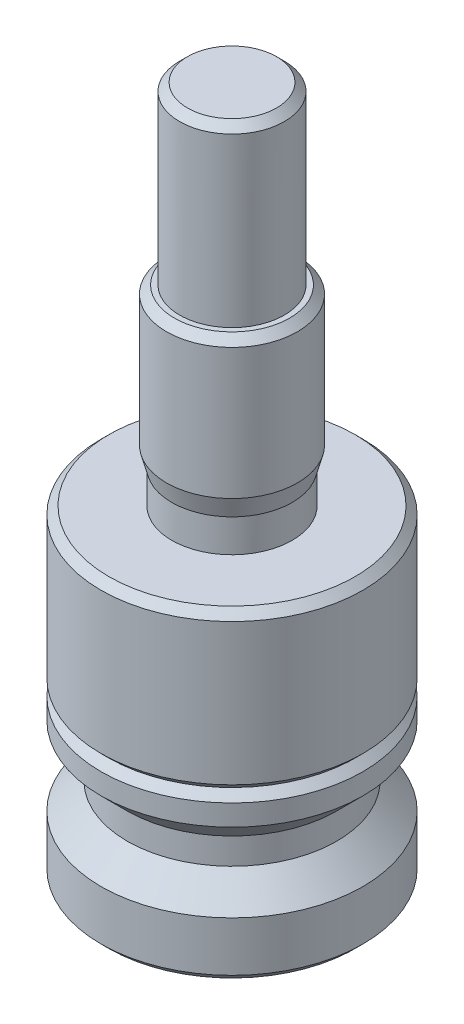
ISO-10303-21;
HEADER;
FILE_DESCRIPTION(('STEP AP214'),'2;1');
FILE_NAME('part.step','',(''),(''),'','','');
FILE_SCHEMA(('AUTOMOTIVE_DESIGN { 1 0 10303 214 1 1 1 1 }'));
ENDSEC;
DATA;
#1=APPLICATION_CONTEXT('core data for automotive mechanical design processes');
#2=APPLICATION_PROTOCOL_DEFINITION('international standard','automotive_design',2000,#1);
#3=PRODUCT_CONTEXT('',#1,'mechanical');
#4=PRODUCT('Part','Part','',(#3));
#5=PRODUCT_RELATED_PRODUCT_CATEGORY('part','',(#4));
#6=PRODUCT_DEFINITION_FORMATION('','',#4);
#7=PRODUCT_DEFINITION_CONTEXT('part definition',#1,'design');
#8=PRODUCT_DEFINITION('design','',#6,#7);
#9=PRODUCT_DEFINITION_SHAPE('','',#8);
#10=(LENGTH_UNIT() NAMED_UNIT(*) SI_UNIT(.MILLI.,.METRE.));
#11=(NAMED_UNIT(*) PLANE_ANGLE_UNIT() SI_UNIT($,.RADIAN.));
#12=(NAMED_UNIT(*) SI_UNIT($,.STERADIAN.) SOLID_ANGLE_UNIT());
#13=UNCERTAINTY_MEASURE_WITH_UNIT(LENGTH_MEASURE(1.E-05),#10,'distance_accuracy_value','');
#14=(GEOMETRIC_REPRESENTATION_CONTEXT(3) GLOBAL_UNCERTAINTY_ASSIGNED_CONTEXT((#13)) GLOBAL_UNIT_ASSIGNED_CONTEXT((#10,
#11,#12)) REPRESENTATION_CONTEXT('',''));
#15=CARTESIAN_POINT('',(0.,0.,0.));
#16=DIRECTION('',(0.,0.,1.));
#17=DIRECTION('',(1.,0.,0.));
#18=AXIS2_PLACEMENT_3D('',#15,#16,#17);
#19=CARTESIAN_POINT('',(2.5,4.,2.8867513459481));
#20=DIRECTION('',(0.,-1.,0.));
#21=DIRECTION('',(-1.,0.,0.));
#22=AXIS2_PLACEMENT_3D('',#19,#20,#21);
#23=PLANE('',#22);
#24=DIRECTION('',(-0.866025403784448,0.,0.499999999999983));
#25=VECTOR('',#24,1.);
#26=CARTESIAN_POINT('',(-1.25,4.,-2.1650635094611));
#27=LINE('',#26,#25);
#28=CARTESIAN_POINT('',(-2.50000107421267E-10,4.,-2.88675134580376));
#29=VERTEX_POINT('',#28);
#30=CARTESIAN_POINT('',(-2.5,4.,-1.4433756729741));
#31=VERTEX_POINT('',#30);
#32=EDGE_CURVE('E112',#29,#31,#27,.T.);
#33=ORIENTED_EDGE('',*,*,#32,.F.);
#34=DIRECTION('',(-0.866025403784448,0.,-0.499999999999983));
#35=VECTOR('',#34,1.);
#36=CARTESIAN_POINT('',(1.25,4.,-2.1650635094611));
#37=LINE('',#36,#35);
#38=CARTESIAN_POINT('',(2.5,4.,-1.4433756729741));
#39=VERTEX_POINT('',#38);
#40=EDGE_CURVE('E113',#39,#29,#37,.T.);
#41=ORIENTED_EDGE('',*,*,#40,.F.);
#42=DIRECTION('',(0.,0.,-1.));
#43=VECTOR('',#42,1.);
#44=CARTESIAN_POINT('',(2.5,4.,0.));
#45=LINE('',#44,#43);
#46=CARTESIAN_POINT('',(2.5,4.,1.4433756729741));
#47=VERTEX_POINT('',#46);
#48=EDGE_CURVE('E79',#47,#39,#45,.T.);
#49=ORIENTED_EDGE('',*,*,#48,.F.);
#50=DIRECTION('',(0.866025403784448,0.,-0.499999999999983));
#51=VECTOR('',#50,1.);
#52=CARTESIAN_POINT('',(1.25,4.,2.1650635094611));
#53=LINE('',#52,#51);
#54=CARTESIAN_POINT('',(2.50000107421267E-10,4.,2.88675134580376));
#55=VERTEX_POINT('',#54);
#56=EDGE_CURVE('E76',#55,#47,#53,.T.);
#57=ORIENTED_EDGE('',*,*,#56,.F.);
#58=DIRECTION('',(0.866025403784448,0.,0.499999999999983));
#59=VECTOR('',#58,1.);
#60=CARTESIAN_POINT('',(-1.25,4.,2.1650635094611));
#61=LINE('',#60,#59);
#62=CARTESIAN_POINT('',(-2.5,4.,1.4433756729741));
#63=VERTEX_POINT('',#62);
#64=EDGE_CURVE('E77',#63,#55,#61,.T.);
#65=ORIENTED_EDGE('',*,*,#64,.F.);
#66=DIRECTION('',(0.,0.,1.));
#67=VECTOR('',#66,1.);
#68=CARTESIAN_POINT('',(-2.5,4.,0.));
#69=LINE('',#68,#67);
#70=EDGE_CURVE('E122',#31,#63,#69,.T.);
#71=ORIENTED_EDGE('',*,*,#70,.F.);
#72=EDGE_LOOP('',(#33,#41,#49,#57,#65,#71));
#73=FACE_BOUND('',#72,.T.);
#74=ADVANCED_FACE('F15',(#73),#23,.T.);
#75=CARTESIAN_POINT('',(2.5,0.,1.4433756729741));
#76=DIRECTION('',(-1.,0.,0.));
#77=DIRECTION('',(0.,1.,0.));
#78=AXIS2_PLACEMENT_3D('',#75,#76,#77);
#79=PLANE('',#78);
#80=CARTESIAN_POINT('',(2.5,0.,1.4433756729741));
#81=CARTESIAN_POINT('',(2.5,4.,1.4433756729741));
#82=B_SPLINE_CURVE_WITH_KNOTS('',1,(#80,#81),.UNSPECIFIED.,.F.,.F.,(2,2),(-4.,0.),.UNSPECIFIED.);
#83=CARTESIAN_POINT('',(2.5,1.37436934730573E-11,1.4433756729741));
#84=VERTEX_POINT('',#83);
#85=EDGE_CURVE('E81',#47,#84,#82,.F.);
#86=ORIENTED_EDGE('',*,*,#85,.F.);
#87=ORIENTED_EDGE('',*,*,#48,.T.);
#88=CARTESIAN_POINT('',(2.5,4.,-1.4433756729741));
#89=CARTESIAN_POINT('',(2.5,0.,-1.4433756729741));
#90=B_SPLINE_CURVE_WITH_KNOTS('',1,(#88,#89),.UNSPECIFIED.,.F.,.F.,(2,2),(-4.,0.),.UNSPECIFIED.);
#91=CARTESIAN_POINT('',(2.5,1.37436934730573E-11,-1.4433756729741));
#92=VERTEX_POINT('',#91);
#93=EDGE_CURVE('E49',#92,#39,#90,.F.);
#94=ORIENTED_EDGE('',*,*,#93,.F.);
#95=DIRECTION('',(0.,0.,-1.));
#96=VECTOR('',#95,1.);
#97=CARTESIAN_POINT('',(2.5,2.74873869461146E-11,0.));
#98=LINE('',#97,#96);
#99=EDGE_CURVE('E55',#84,#92,#98,.T.);
#100=ORIENTED_EDGE('',*,*,#99,.F.);
#101=EDGE_LOOP('',(#86,#87,#94,#100));
#102=FACE_BOUND('',#101,.T.);
#103=ADVANCED_FACE('F441',(#102),#79,.T.);
#104=CARTESIAN_POINT('',(0.,4.,-2.8867513459481));
#105=DIRECTION('',(-0.499999999999983,0.,0.866025403784448));
#106=DIRECTION('',(0.,-1.,0.));
#107=AXIS2_PLACEMENT_3D('',#104,#105,#106);
#108=PLANE('',#107);
#109=CARTESIAN_POINT('',(0.,4.,-2.8867513459481));
#110=CARTESIAN_POINT('',(0.,0.,-2.8867513459481));
#111=B_SPLINE_CURVE_WITH_KNOTS('',1,(#109,#110),.UNSPECIFIED.,.F.,.F.,(2,2),(-4.,0.),.UNSPECIFIED.);
#112=CARTESIAN_POINT('',(0.,1.37437700109544E-11,-2.8867513459481));
#113=VERTEX_POINT('',#112);
#114=EDGE_CURVE('E114',#113,#29,#111,.F.);
#115=ORIENTED_EDGE('',*,*,#114,.F.);
#116=DIRECTION('',(-0.866025403784448,0.,-0.499999999999983));
#117=VECTOR('',#116,1.);
#118=CARTESIAN_POINT('',(2.5,2.74873869461146E-11,-1.4433756729741));
#119=LINE('',#118,#117);
#120=EDGE_CURVE('E19',#92,#113,#119,.T.);
#121=ORIENTED_EDGE('',*,*,#120,.F.);
#122=ORIENTED_EDGE('',*,*,#93,.T.);
#123=ORIENTED_EDGE('',*,*,#40,.T.);
#124=EDGE_LOOP('',(#115,#121,#122,#123));
#125=FACE_BOUND('',#124,.T.);
#126=ADVANCED_FACE('F175',(#125),#108,.T.);
#127=CARTESIAN_POINT('',(-2.5,4.,-1.4433756729741));
#128=DIRECTION('',(0.499999999999983,0.,0.866025403784448));
#129=DIRECTION('',(0.,-1.,0.));
#130=AXIS2_PLACEMENT_3D('',#127,#128,#129);
#131=PLANE('',#130);
#132=CARTESIAN_POINT('',(-2.5,4.,-1.4433756729741));
#133=CARTESIAN_POINT('',(-2.5,0.,-1.4433756729741));
#134=B_SPLINE_CURVE_WITH_KNOTS('',1,(#132,#133),.UNSPECIFIED.,.F.,.F.,(2,2),(-4.,0.),.UNSPECIFIED.);
#135=CARTESIAN_POINT('',(-2.5,1.37438465488515E-11,-1.4433756729741));
#136=VERTEX_POINT('',#135);
#137=EDGE_CURVE('E86',#136,#31,#134,.F.);
#138=ORIENTED_EDGE('',*,*,#137,.F.);
#139=DIRECTION('',(-0.866025403784448,0.,0.499999999999983));
#140=VECTOR('',#139,1.);
#141=CARTESIAN_POINT('',(0.,2.74875400219088E-11,-2.8867513459481));
#142=LINE('',#141,#140);
#143=EDGE_CURVE('E167',#113,#136,#142,.T.);
#144=ORIENTED_EDGE('',*,*,#143,.F.);
#145=ORIENTED_EDGE('',*,*,#114,.T.);
#146=ORIENTED_EDGE('',*,*,#32,.T.);
#147=EDGE_LOOP('',(#138,#144,#145,#146));
#148=FACE_BOUND('',#147,.T.);
#149=ADVANCED_FACE('F177',(#148),#131,.T.);
#150=CARTESIAN_POINT('',(-2.5,4.,1.4433756729741));
#151=DIRECTION('',(1.,0.,0.));
#152=DIRECTION('',(0.,-1.,0.));
#153=AXIS2_PLACEMENT_3D('',#150,#151,#152);
#154=PLANE('',#153);
#155=CARTESIAN_POINT('',(-2.5,0.,1.4433756729741));
#156=CARTESIAN_POINT('',(-2.5,4.,1.4433756729741));
#157=B_SPLINE_CURVE_WITH_KNOTS('',1,(#155,#156),.UNSPECIFIED.,.F.,.F.,(2,2),(-4.,0.),.UNSPECIFIED.);
#158=CARTESIAN_POINT('',(-2.5,1.37438465488515E-11,1.4433756729741));
#159=VERTEX_POINT('',#158);
#160=EDGE_CURVE('E85',#159,#63,#157,.T.);
#161=ORIENTED_EDGE('',*,*,#160,.F.);
#162=DIRECTION('',(0.,0.,1.));
#163=VECTOR('',#162,1.);
#164=CARTESIAN_POINT('',(-2.5,2.7487693097703E-11,0.));
#165=LINE('',#164,#163);
#166=EDGE_CURVE('E97',#136,#159,#165,.T.);
#167=ORIENTED_EDGE('',*,*,#166,.F.);
#168=ORIENTED_EDGE('',*,*,#137,.T.);
#169=ORIENTED_EDGE('',*,*,#70,.T.);
#170=EDGE_LOOP('',(#161,#167,#168,#169));
#171=FACE_BOUND('',#170,.T.);
#172=ADVANCED_FACE('F180',(#171),#154,.T.);
#173=CARTESIAN_POINT('',(-2.5,0.,1.4433756729741));
#174=DIRECTION('',(0.499999999999983,0.,-0.866025403784448));
#175=DIRECTION('',(0.,1.,0.));
#176=AXIS2_PLACEMENT_3D('',#173,#174,#175);
#177=PLANE('',#176);
#178=ORIENTED_EDGE('',*,*,#160,.T.);
#179=ORIENTED_EDGE('',*,*,#64,.T.);
#180=CARTESIAN_POINT('',(0.,0.,2.8867513459481));
#181=CARTESIAN_POINT('',(0.,4.,2.8867513459481));
#182=B_SPLINE_CURVE_WITH_KNOTS('',1,(#180,#181),.UNSPECIFIED.,.F.,.F.,(2,2),(-4.,0.),.UNSPECIFIED.);
#183=CARTESIAN_POINT('',(0.,1.37437700109544E-11,2.8867513459481));
#184=VERTEX_POINT('',#183);
#185=EDGE_CURVE('E34',#184,#55,#182,.T.);
#186=ORIENTED_EDGE('',*,*,#185,.F.);
#187=DIRECTION('',(0.866025403784448,0.,0.499999999999983));
#188=VECTOR('',#187,1.);
#189=CARTESIAN_POINT('',(-2.5,2.7487693097703E-11,1.4433756729741));
#190=LINE('',#189,#188);
#191=EDGE_CURVE('E166',#159,#184,#190,.T.);
#192=ORIENTED_EDGE('',*,*,#191,.F.);
#193=EDGE_LOOP('',(#178,#179,#186,#192));
#194=FACE_BOUND('',#193,.T.);
#195=ADVANCED_FACE('F84',(#194),#177,.T.);
#196=CARTESIAN_POINT('',(0.,0.,2.8867513459481));
#197=DIRECTION('',(-0.499999999999983,0.,-0.866025403784448));
#198=DIRECTION('',(0.,1.,0.));
#199=AXIS2_PLACEMENT_3D('',#196,#197,#198);
#200=PLANE('',#199);
#201=ORIENTED_EDGE('',*,*,#185,.T.);
#202=ORIENTED_EDGE('',*,*,#56,.T.);
#203=ORIENTED_EDGE('',*,*,#85,.T.);
#204=DIRECTION('',(0.866025403784448,0.,-0.499999999999983));
#205=VECTOR('',#204,1.);
#206=CARTESIAN_POINT('',(0.,2.74875400219088E-11,2.8867513459481));
#207=LINE('',#206,#205);
#208=EDGE_CURVE('E90',#184,#84,#207,.T.);
#209=ORIENTED_EDGE('',*,*,#208,.F.);
#210=EDGE_LOOP('',(#201,#202,#203,#209));
#211=FACE_BOUND('',#210,.T.);
#212=ADVANCED_FACE('F88',(#211),#200,.T.);
#213=CARTESIAN_POINT('',(3.2640000000308,2.74873401661519E-11,-3.2000000000302));
#214=DIRECTION('',(0.,-1.,0.));
#215=DIRECTION('',(0.,0.,1.));
#216=AXIS2_PLACEMENT_3D('',#213,#214,#215);
#217=PLANE('',#216);
#218=CARTESIAN_POINT('',(0.,4.12531337215527E-11,0.));
#219=DIRECTION('',(0.,1.,0.));
#220=DIRECTION('',(0.,0.,1.));
#221=AXIS2_PLACEMENT_3D('',#218,#219,#220);
#222=CIRCLE('',#221,3.20000000001648);
#223=CARTESIAN_POINT('',(0.,4.12531337215527E-11,3.20000000001648));
#224=VERTEX_POINT('',#223);
#225=EDGE_CURVE('E162',#224,#224,#222,.T.);
#226=ORIENTED_EDGE('',*,*,#225,.F.);
#227=EDGE_LOOP('',(#226));
#228=FACE_BOUND('',#227,.T.);
#229=ORIENTED_EDGE('',*,*,#191,.T.);
#230=ORIENTED_EDGE('',*,*,#208,.T.);
#231=ORIENTED_EDGE('',*,*,#99,.T.);
#232=ORIENTED_EDGE('',*,*,#120,.T.);
#233=ORIENTED_EDGE('',*,*,#143,.T.);
#234=ORIENTED_EDGE('',*,*,#166,.T.);
#235=EDGE_LOOP('',(#229,#230,#231,#232,#233,#234));
#236=FACE_BOUND('',#235,.T.);
#237=ADVANCED_FACE('F173',(#228,#236),#217,.T.);
#238=CARTESIAN_POINT('',(0.,0.30000000002407,0.));
#239=DIRECTION('',(0.,1.,0.));
#240=DIRECTION('',(0.,0.,1.));
#241=AXIS2_PLACEMENT_3D('',#238,#239,#240);
#242=CONICAL_SURFACE('',#241,3.4999999999993,0.785398163397455);
#243=CARTESIAN_POINT('',(0.,0.30000000002407,0.));
#244=DIRECTION('',(0.,1.,0.));
#245=DIRECTION('',(0.,0.,1.));
#246=AXIS2_PLACEMENT_3D('',#243,#244,#245);
#247=CIRCLE('',#246,3.4999999999993);
#248=CARTESIAN_POINT('',(0.,0.30000000002407,3.4999999999993));
#249=VERTEX_POINT('',#248);
#250=EDGE_CURVE('E161',#249,#249,#247,.T.);
#251=ORIENTED_EDGE('',*,*,#250,.F.);
#252=EDGE_LOOP('',(#251));
#253=FACE_BOUND('',#252,.T.);
#254=ORIENTED_EDGE('',*,*,#225,.T.);
#255=EDGE_LOOP('',(#254));
#256=FACE_BOUND('',#255,.T.);
#257=ADVANCED_FACE('F395',(#253,#256),#242,.T.);
#258=CARTESIAN_POINT('',(0.,0.70000000002393,0.));
#259=DIRECTION('',(0.,-1.,0.));
#260=DIRECTION('',(0.,0.,-1.));
#261=AXIS2_PLACEMENT_3D('',#258,#259,#260);
#262=CYLINDRICAL_SURFACE('',#261,3.4999999999993);
#263=CARTESIAN_POINT('',(0.,0.70000000002393,0.));
#264=DIRECTION('',(0.,-1.,0.));
#265=DIRECTION('',(0.,0.,-1.));
#266=AXIS2_PLACEMENT_3D('',#263,#264,#265);
#267=CIRCLE('',#266,3.4999999999993);
#268=CARTESIAN_POINT('',(0.,0.70000000002393,-3.4999999999993));
#269=VERTEX_POINT('',#268);
#270=EDGE_CURVE('E158',#269,#269,#267,.F.);
#271=ORIENTED_EDGE('',*,*,#270,.F.);
#272=EDGE_LOOP('',(#271));
#273=FACE_BOUND('',#272,.T.);
#274=ORIENTED_EDGE('',*,*,#250,.T.);
#275=EDGE_LOOP('',(#274));
#276=FACE_BOUND('',#275,.T.);
#277=ADVANCED_FACE('F387',(#273,#276),#262,.T.);
#278=CARTESIAN_POINT('',(4.79399999997093,0.70000000002393,-4.6999999999715));
#279=DIRECTION('',(0.,-1.,0.));
#280=DIRECTION('',(0.,0.,1.));
#281=AXIS2_PLACEMENT_3D('',#278,#279,#280);
#282=PLANE('',#281);
#283=ORIENTED_EDGE('',*,*,#270,.T.);
#284=EDGE_LOOP('',(#283));
#285=FACE_BOUND('',#284,.T.);
#286=CARTESIAN_POINT('',(0.,0.700000000023934,0.));
#287=DIRECTION('',(0.,1.,0.));
#288=DIRECTION('',(0.,0.,1.));
#289=AXIS2_PLACEMENT_3D('',#286,#287,#288);
#290=CIRCLE('',#289,4.6999999999715);
#291=CARTESIAN_POINT('',(0.,0.700000000023934,4.6999999999715));
#292=VERTEX_POINT('',#291);
#293=EDGE_CURVE('E154',#292,#292,#290,.T.);
#294=ORIENTED_EDGE('',*,*,#293,.F.);
#295=EDGE_LOOP('',(#294));
#296=FACE_BOUND('',#295,.T.);
#297=ADVANCED_FACE('F379',(#285,#296),#282,.T.);
#298=CARTESIAN_POINT('',(0.,1.000000000024,0.));
#299=DIRECTION('',(0.,1.,0.));
#300=DIRECTION('',(0.,0.,1.));
#301=AXIS2_PLACEMENT_3D('',#298,#299,#300);
#302=CONICAL_SURFACE('',#301,4.9999999999716,0.785398163397501);
#303=CARTESIAN_POINT('',(0.,1.000000000024,0.));
#304=DIRECTION('',(0.,1.,0.));
#305=DIRECTION('',(0.,0.,1.));
#306=AXIS2_PLACEMENT_3D('',#303,#304,#305);
#307=CIRCLE('',#306,4.9999999999716);
#308=CARTESIAN_POINT('',(0.,1.000000000024,4.9999999999716));
#309=VERTEX_POINT('',#308);
#310=EDGE_CURVE('E157',#309,#309,#307,.T.);
#311=ORIENTED_EDGE('',*,*,#310,.F.);
#312=EDGE_LOOP('',(#311));
#313=FACE_BOUND('',#312,.T.);
#314=ORIENTED_EDGE('',*,*,#293,.T.);
#315=EDGE_LOOP('',(#314));
#316=FACE_BOUND('',#315,.T.);
#317=ADVANCED_FACE('F371',(#313,#316),#302,.T.);
#318=CARTESIAN_POINT('',(0.,2.9000000000208,0.));
#319=DIRECTION('',(0.,-1.,0.));
#320=DIRECTION('',(0.,0.,-1.));
#321=AXIS2_PLACEMENT_3D('',#318,#319,#320);
#322=CYLINDRICAL_SURFACE('',#321,4.9999999999716);
#323=CARTESIAN_POINT('',(0.,2.9000000000208,0.));
#324=DIRECTION('',(0.,1.,0.));
#325=DIRECTION('',(0.,0.,1.));
#326=AXIS2_PLACEMENT_3D('',#323,#324,#325);
#327=CIRCLE('',#326,4.9999999999716);
#328=CARTESIAN_POINT('',(0.,2.9000000000208,4.9999999999716));
#329=VERTEX_POINT('',#328);
#330=EDGE_CURVE('E191',#329,#329,#327,.T.);
#331=ORIENTED_EDGE('',*,*,#330,.F.);
#332=EDGE_LOOP('',(#331));
#333=FACE_BOUND('',#332,.T.);
#334=ORIENTED_EDGE('',*,*,#310,.T.);
#335=EDGE_LOOP('',(#334));
#336=FACE_BOUND('',#335,.T.);
#337=ADVANCED_FACE('F363',(#333,#336),#322,.T.);
#338=CARTESIAN_POINT('',(0.,3.9000000000208,0.));
#339=DIRECTION('',(0.,-1.,0.));
#340=DIRECTION('',(0.,0.,-1.));
#341=AXIS2_PLACEMENT_3D('',#338,#339,#340);
#342=CONICAL_SURFACE('',#341,3.9999999999716,0.785398163397449);
#343=CARTESIAN_POINT('',(0.,3.9000000000208,0.));
#344=DIRECTION('',(0.,1.,0.));
#345=DIRECTION('',(0.,0.,1.));
#346=AXIS2_PLACEMENT_3D('',#343,#344,#345);
#347=CIRCLE('',#346,3.9999999999716);
#348=CARTESIAN_POINT('',(0.,3.9000000000208,3.9999999999716));
#349=VERTEX_POINT('',#348);
#350=EDGE_CURVE('E194',#349,#349,#347,.T.);
#351=ORIENTED_EDGE('',*,*,#350,.F.);
#352=EDGE_LOOP('',(#351));
#353=FACE_BOUND('',#352,.T.);
#354=ORIENTED_EDGE('',*,*,#330,.T.);
#355=EDGE_LOOP('',(#354));
#356=FACE_BOUND('',#355,.T.);
#357=ADVANCED_FACE('F355',(#353,#356),#342,.T.);
#358=CARTESIAN_POINT('',(0.,4.9000000000208,0.));
#359=DIRECTION('',(0.,-1.,0.));
#360=DIRECTION('',(0.,0.,-1.));
#361=AXIS2_PLACEMENT_3D('',#358,#359,#360);
#362=CYLINDRICAL_SURFACE('',#361,3.9999999999716);
#363=CARTESIAN_POINT('',(0.,4.9000000000208,0.));
#364=DIRECTION('',(0.,1.,0.));
#365=DIRECTION('',(0.,0.,1.));
#366=AXIS2_PLACEMENT_3D('',#363,#364,#365);
#367=CIRCLE('',#366,3.9999999999716);
#368=CARTESIAN_POINT('',(0.,4.9000000000208,3.9999999999716));
#369=VERTEX_POINT('',#368);
#370=EDGE_CURVE('E197',#369,#369,#367,.T.);
#371=ORIENTED_EDGE('',*,*,#370,.F.);
#372=EDGE_LOOP('',(#371));
#373=FACE_BOUND('',#372,.T.);
#374=ORIENTED_EDGE('',*,*,#350,.T.);
#375=EDGE_LOOP('',(#374));
#376=FACE_BOUND('',#375,.T.);
#377=ADVANCED_FACE('F347',(#373,#376),#362,.T.);
#378=CARTESIAN_POINT('',(0.,5.9000000000208,0.));
#379=DIRECTION('',(0.,1.,0.));
#380=DIRECTION('',(0.,0.,1.));
#381=AXIS2_PLACEMENT_3D('',#378,#379,#380);
#382=CONICAL_SURFACE('',#381,4.9999999999684,0.785398163395848);
#383=CARTESIAN_POINT('',(0.,5.9000000000208,0.));
#384=DIRECTION('',(0.,1.,0.));
#385=DIRECTION('',(0.,0.,1.));
#386=AXIS2_PLACEMENT_3D('',#383,#384,#385);
#387=CIRCLE('',#386,4.9999999999684);
#388=CARTESIAN_POINT('',(0.,5.9000000000208,4.9999999999684));
#389=VERTEX_POINT('',#388);
#390=EDGE_CURVE('E200',#389,#389,#387,.T.);
#391=ORIENTED_EDGE('',*,*,#390,.F.);
#392=EDGE_LOOP('',(#391));
#393=FACE_BOUND('',#392,.T.);
#394=ORIENTED_EDGE('',*,*,#370,.T.);
#395=EDGE_LOOP('',(#394));
#396=FACE_BOUND('',#395,.T.);
#397=ADVANCED_FACE('F339',(#393,#396),#382,.T.);
#398=CARTESIAN_POINT('',(0.,6.7000000000114,0.));
#399=DIRECTION('',(0.,-1.,0.));
#400=DIRECTION('',(0.,0.,-1.));
#401=AXIS2_PLACEMENT_3D('',#398,#399,#400);
#402=CYLINDRICAL_SURFACE('',#401,4.9999999999684);
#403=CARTESIAN_POINT('',(0.,6.7000000000114,0.));
#404=DIRECTION('',(0.,1.,0.));
#405=DIRECTION('',(0.,0.,1.));
#406=AXIS2_PLACEMENT_3D('',#403,#404,#405);
#407=CIRCLE('',#406,4.9999999999684);
#408=CARTESIAN_POINT('',(0.,6.7000000000114,4.9999999999684));
#409=VERTEX_POINT('',#408);
#410=EDGE_CURVE('E203',#409,#409,#407,.T.);
#411=ORIENTED_EDGE('',*,*,#410,.F.);
#412=EDGE_LOOP('',(#411));
#413=FACE_BOUND('',#412,.T.);
#414=ORIENTED_EDGE('',*,*,#390,.T.);
#415=EDGE_LOOP('',(#414));
#416=FACE_BOUND('',#415,.T.);
#417=ADVANCED_FACE('F331',(#413,#416),#402,.T.);
#418=CARTESIAN_POINT('',(0.,7.0000000000114,0.));
#419=DIRECTION('',(0.,-1.,0.));
#420=DIRECTION('',(0.,0.,-1.));
#421=AXIS2_PLACEMENT_3D('',#418,#419,#420);
#422=CONICAL_SURFACE('',#421,4.6999999999684,0.78539816339745);
#423=CARTESIAN_POINT('',(0.,7.0000000000114,0.));
#424=DIRECTION('',(0.,1.,0.));
#425=DIRECTION('',(0.,0.,1.));
#426=AXIS2_PLACEMENT_3D('',#423,#424,#425);
#427=CIRCLE('',#426,4.6999999999684);
#428=CARTESIAN_POINT('',(0.,7.0000000000114,4.6999999999684));
#429=VERTEX_POINT('',#428);
#430=EDGE_CURVE('E206',#429,#429,#427,.T.);
#431=ORIENTED_EDGE('',*,*,#430,.F.);
#432=EDGE_LOOP('',(#431));
#433=FACE_BOUND('',#432,.T.);
#434=ORIENTED_EDGE('',*,*,#410,.T.);
#435=EDGE_LOOP('',(#434));
#436=FACE_BOUND('',#435,.T.);
#437=ADVANCED_FACE('F323',(#433,#436),#422,.T.);
#438=CARTESIAN_POINT('',(0.,7.3000000000114,0.));
#439=DIRECTION('',(0.,1.,0.));
#440=DIRECTION('',(0.,0.,1.));
#441=AXIS2_PLACEMENT_3D('',#438,#439,#440);
#442=CONICAL_SURFACE('',#441,4.9999999999685,0.785398163397617);
#443=CARTESIAN_POINT('',(0.,7.3000000000114,0.));
#444=DIRECTION('',(0.,1.,0.));
#445=DIRECTION('',(0.,0.,1.));
#446=AXIS2_PLACEMENT_3D('',#443,#444,#445);
#447=CIRCLE('',#446,4.9999999999685);
#448=CARTESIAN_POINT('',(0.,7.3000000000114,4.9999999999685));
#449=VERTEX_POINT('',#448);
#450=EDGE_CURVE('E209',#449,#449,#447,.T.);
#451=ORIENTED_EDGE('',*,*,#450,.F.);
#452=EDGE_LOOP('',(#451));
#453=FACE_BOUND('',#452,.T.);
#454=ORIENTED_EDGE('',*,*,#430,.T.);
#455=EDGE_LOOP('',(#454));
#456=FACE_BOUND('',#455,.T.);
#457=ADVANCED_FACE('F315',(#453,#456),#442,.T.);
#458=CARTESIAN_POINT('',(0.,12.7,0.));
#459=DIRECTION('',(0.,-1.,0.));
#460=DIRECTION('',(0.,0.,-1.));
#461=AXIS2_PLACEMENT_3D('',#458,#459,#460);
#462=CYLINDRICAL_SURFACE('',#461,4.9999999999685);
#463=CARTESIAN_POINT('',(0.,12.7,0.));
#464=DIRECTION('',(0.,1.,0.));
#465=DIRECTION('',(0.,0.,1.));
#466=AXIS2_PLACEMENT_3D('',#463,#464,#465);
#467=CIRCLE('',#466,4.9999999999685);
#468=CARTESIAN_POINT('',(0.,12.7,4.9999999999685));
#469=VERTEX_POINT('',#468);
#470=EDGE_CURVE('E153',#469,#469,#467,.T.);
#471=ORIENTED_EDGE('',*,*,#470,.F.);
#472=EDGE_LOOP('',(#471));
#473=FACE_BOUND('',#472,.T.);
#474=ORIENTED_EDGE('',*,*,#450,.T.);
#475=EDGE_LOOP('',(#474));
#476=FACE_BOUND('',#475,.T.);
#477=ADVANCED_FACE('F307',(#473,#476),#462,.T.);
#478=CARTESIAN_POINT('',(0.,13.,0.));
#479=DIRECTION('',(0.,-1.,0.));
#480=DIRECTION('',(0.,0.,-1.));
#481=AXIS2_PLACEMENT_3D('',#478,#479,#480);
#482=CONICAL_SURFACE('',#481,4.6999999999685,0.785398163397447);
#483=CARTESIAN_POINT('',(0.,13.,0.));
#484=DIRECTION('',(0.,-1.,0.));
#485=DIRECTION('',(0.,0.,-1.));
#486=AXIS2_PLACEMENT_3D('',#483,#484,#485);
#487=CIRCLE('',#486,4.6999999999685);
#488=CARTESIAN_POINT('',(0.,13.,-4.6999999999685));
#489=VERTEX_POINT('',#488);
#490=EDGE_CURVE('E150',#489,#489,#487,.F.);
#491=ORIENTED_EDGE('',*,*,#490,.F.);
#492=EDGE_LOOP('',(#491));
#493=FACE_BOUND('',#492,.T.);
#494=ORIENTED_EDGE('',*,*,#470,.T.);
#495=EDGE_LOOP('',(#494));
#496=FACE_BOUND('',#495,.T.);
#497=ADVANCED_FACE('F299',(#493,#496),#482,.T.);
#498=CARTESIAN_POINT('',(4.79399999996787,13.,4.6999999999685));
#499=DIRECTION('',(0.,1.,0.));
#500=DIRECTION('',(0.,0.,-1.));
#501=AXIS2_PLACEMENT_3D('',#498,#499,#500);
#502=PLANE('',#501);
#503=ORIENTED_EDGE('',*,*,#490,.T.);
#504=EDGE_LOOP('',(#503));
#505=FACE_BOUND('',#504,.T.);
#506=CARTESIAN_POINT('',(0.,13.,0.));
#507=DIRECTION('',(0.,-1.,0.));
#508=DIRECTION('',(0.,0.,-1.));
#509=AXIS2_PLACEMENT_3D('',#506,#507,#508);
#510=CIRCLE('',#509,2.2999999999799);
#511=CARTESIAN_POINT('',(0.,13.,-2.2999999999799));
#512=VERTEX_POINT('',#511);
#513=EDGE_CURVE('E146',#512,#512,#510,.F.);
#514=ORIENTED_EDGE('',*,*,#513,.F.);
#515=EDGE_LOOP('',(#514));
#516=FACE_BOUND('',#515,.T.);
#517=ADVANCED_FACE('F291',(#505,#516),#502,.T.);
#518=CARTESIAN_POINT('',(0.,14.253589838486,0.));
#519=DIRECTION('',(0.,-1.,0.));
#520=DIRECTION('',(0.,0.,-1.));
#521=AXIS2_PLACEMENT_3D('',#518,#519,#520);
#522=CYLINDRICAL_SURFACE('',#521,2.2999999999799);
#523=CARTESIAN_POINT('',(0.,14.253589838486,0.));
#524=DIRECTION('',(0.,1.,0.));
#525=DIRECTION('',(0.,0.,1.));
#526=AXIS2_PLACEMENT_3D('',#523,#524,#525);
#527=CIRCLE('',#526,2.2999999999799);
#528=CARTESIAN_POINT('',(0.,14.253589838486,2.2999999999799));
#529=VERTEX_POINT('',#528);
#530=EDGE_CURVE('E149',#529,#529,#527,.T.);
#531=ORIENTED_EDGE('',*,*,#530,.F.);
#532=EDGE_LOOP('',(#531));
#533=FACE_BOUND('',#532,.T.);
#534=ORIENTED_EDGE('',*,*,#513,.T.);
#535=EDGE_LOOP('',(#534));
#536=FACE_BOUND('',#535,.T.);
#537=ADVANCED_FACE('F283',(#533,#536),#522,.T.);
#538=CARTESIAN_POINT('',(0.,15.,0.));
#539=DIRECTION('',(0.,1.,0.));
#540=DIRECTION('',(0.,0.,1.));
#541=AXIS2_PLACEMENT_3D('',#538,#539,#540);
#542=CONICAL_SURFACE('',#541,2.49999999998,0.2617993877992);
#543=CARTESIAN_POINT('',(0.,15.,0.));
#544=DIRECTION('',(0.,1.,0.));
#545=DIRECTION('',(0.,0.,1.));
#546=AXIS2_PLACEMENT_3D('',#543,#544,#545);
#547=CIRCLE('',#546,2.49999999998);
#548=CARTESIAN_POINT('',(0.,15.,2.49999999998));
#549=VERTEX_POINT('',#548);
#550=EDGE_CURVE('E216',#549,#549,#547,.T.);
#551=ORIENTED_EDGE('',*,*,#550,.F.);
#552=EDGE_LOOP('',(#551));
#553=FACE_BOUND('',#552,.T.);
#554=ORIENTED_EDGE('',*,*,#530,.T.);
#555=EDGE_LOOP('',(#554));
#556=FACE_BOUND('',#555,.T.);
#557=ADVANCED_FACE('F275',(#553,#556),#542,.T.);
#558=CARTESIAN_POINT('',(0.,19.999999999991,0.));
#559=DIRECTION('',(0.,-1.,0.));
#560=DIRECTION('',(0.,0.,-1.));
#561=AXIS2_PLACEMENT_3D('',#558,#559,#560);
#562=CYLINDRICAL_SURFACE('',#561,2.49999999998);
#563=CARTESIAN_POINT('',(0.,19.999999999991,0.));
#564=DIRECTION('',(0.,1.,0.));
#565=DIRECTION('',(0.,0.,1.));
#566=AXIS2_PLACEMENT_3D('',#563,#564,#565);
#567=CIRCLE('',#566,2.49999999998);
#568=CARTESIAN_POINT('',(0.,19.999999999991,2.49999999998));
#569=VERTEX_POINT('',#568);
#570=EDGE_CURVE('E145',#569,#569,#567,.T.);
#571=ORIENTED_EDGE('',*,*,#570,.F.);
#572=EDGE_LOOP('',(#571));
#573=FACE_BOUND('',#572,.T.);
#574=ORIENTED_EDGE('',*,*,#550,.T.);
#575=EDGE_LOOP('',(#574));
#576=FACE_BOUND('',#575,.T.);
#577=ADVANCED_FACE('F267',(#573,#576),#562,.T.);
#578=CARTESIAN_POINT('',(0.,20.3,0.));
#579=DIRECTION('',(0.,-1.,0.));
#580=DIRECTION('',(0.,0.,-1.));
#581=AXIS2_PLACEMENT_3D('',#578,#579,#580);
#582=CONICAL_SURFACE('',#581,2.1999999999714,0.785398163396772);
#583=CARTESIAN_POINT('',(0.,20.3,0.));
#584=DIRECTION('',(0.,-1.,0.));
#585=DIRECTION('',(0.,0.,-1.));
#586=AXIS2_PLACEMENT_3D('',#583,#584,#585);
#587=CIRCLE('',#586,2.1999999999714);
#588=CARTESIAN_POINT('',(0.,20.3,-2.1999999999714));
#589=VERTEX_POINT('',#588);
#590=EDGE_CURVE('E142',#589,#589,#587,.F.);
#591=ORIENTED_EDGE('',*,*,#590,.F.);
#592=EDGE_LOOP('',(#591));
#593=FACE_BOUND('',#592,.T.);
#594=ORIENTED_EDGE('',*,*,#570,.T.);
#595=EDGE_LOOP('',(#594));
#596=FACE_BOUND('',#595,.T.);
#597=ADVANCED_FACE('F237',(#593,#596),#582,.T.);
#598=CARTESIAN_POINT('',(2.24399999997083,20.3,2.1999999999714));
#599=DIRECTION('',(0.,1.,0.));
#600=DIRECTION('',(0.,0.,-1.));
#601=AXIS2_PLACEMENT_3D('',#598,#599,#600);
#602=PLANE('',#601);
#603=ORIENTED_EDGE('',*,*,#590,.T.);
#604=EDGE_LOOP('',(#603));
#605=FACE_BOUND('',#604,.T.);
#606=CARTESIAN_POINT('',(0.,20.3,0.));
#607=DIRECTION('',(0.,-1.,0.));
#608=DIRECTION('',(0.,0.,-1.));
#609=AXIS2_PLACEMENT_3D('',#606,#607,#608);
#610=CIRCLE('',#609,1.99999999998);
#611=CARTESIAN_POINT('',(0.,20.3,-1.99999999998));
#612=VERTEX_POINT('',#611);
#613=EDGE_CURVE('E139',#612,#612,#610,.F.);
#614=ORIENTED_EDGE('',*,*,#613,.F.);
#615=EDGE_LOOP('',(#614));
#616=FACE_BOUND('',#615,.T.);
#617=ADVANCED_FACE('F228',(#605,#616),#602,.T.);
#618=CARTESIAN_POINT('',(0.,26.7,0.));
#619=DIRECTION('',(0.,-1.,0.));
#620=DIRECTION('',(0.,0.,-1.));
#621=AXIS2_PLACEMENT_3D('',#618,#619,#620);
#622=CYLINDRICAL_SURFACE('',#621,1.99999999998);
#623=ORIENTED_EDGE('',*,*,#613,.T.);
#624=EDGE_LOOP('',(#623));
#625=FACE_BOUND('',#624,.T.);
#626=CARTESIAN_POINT('',(0.,26.7,0.));
#627=DIRECTION('',(0.,1.,0.));
#628=DIRECTION('',(0.,0.,1.));
#629=AXIS2_PLACEMENT_3D('',#626,#627,#628);
#630=CIRCLE('',#629,1.99999999998);
#631=CARTESIAN_POINT('',(0.,26.7,1.99999999998));
#632=VERTEX_POINT('',#631);
#633=EDGE_CURVE('E25',#632,#632,#630,.T.);
#634=ORIENTED_EDGE('',*,*,#633,.F.);
#635=EDGE_LOOP('',(#634));
#636=FACE_BOUND('',#635,.T.);
#637=ADVANCED_FACE('F225',(#625,#636),#622,.T.);
#638=CARTESIAN_POINT('',(1.73399999998286,27.,1.6999999999832));
#639=DIRECTION('',(0.,1.,0.));
#640=DIRECTION('',(0.,0.,-1.));
#641=AXIS2_PLACEMENT_3D('',#638,#639,#640);
#642=PLANE('',#641);
#643=CARTESIAN_POINT('',(0.,27.,0.));
#644=DIRECTION('',(0.,-1.,0.));
#645=DIRECTION('',(0.,0.,-1.));
#646=AXIS2_PLACEMENT_3D('',#643,#644,#645);
#647=CIRCLE('',#646,1.6999999999832);
#648=CARTESIAN_POINT('',(0.,27.,-1.6999999999832));
#649=VERTEX_POINT('',#648);
#650=EDGE_CURVE('E9',#649,#649,#647,.T.);
#651=ORIENTED_EDGE('',*,*,#650,.F.);
#652=EDGE_LOOP('',(#651));
#653=FACE_BOUND('',#652,.T.);
#654=ADVANCED_FACE('F227',(#653),#642,.T.);
#655=CARTESIAN_POINT('',(0.,27.,0.));
#656=DIRECTION('',(0.,-1.,0.));
#657=DIRECTION('',(0.,0.,-1.));
#658=AXIS2_PLACEMENT_3D('',#655,#656,#657);
#659=CONICAL_SURFACE('',#658,1.6999999999832,0.785398163392118);
#660=ORIENTED_EDGE('',*,*,#650,.T.);
#661=EDGE_LOOP('',(#660));
#662=FACE_BOUND('',#661,.T.);
#663=ORIENTED_EDGE('',*,*,#633,.T.);
#664=EDGE_LOOP('',(#663));
#665=FACE_BOUND('',#664,.T.);
#666=ADVANCED_FACE('F17',(#662,#665),#659,.T.);
#667=CLOSED_SHELL('',(#74,#103,#126,#149,#172,#195,#212,#237,#257,#277,#297,#317,#337,#357,#377,
#397,#417,#437,#457,#477,#497,#517,#537,#557,#577,#597,#617,#637,#654,#666));
#668=MANIFOLD_SOLID_BREP('B1',#667);
#669=ADVANCED_BREP_SHAPE_REPRESENTATION('',(#18,#668),#14);
#670=SHAPE_DEFINITION_REPRESENTATION(#9,#669);
ENDSEC;
END-ISO-10303-21;
